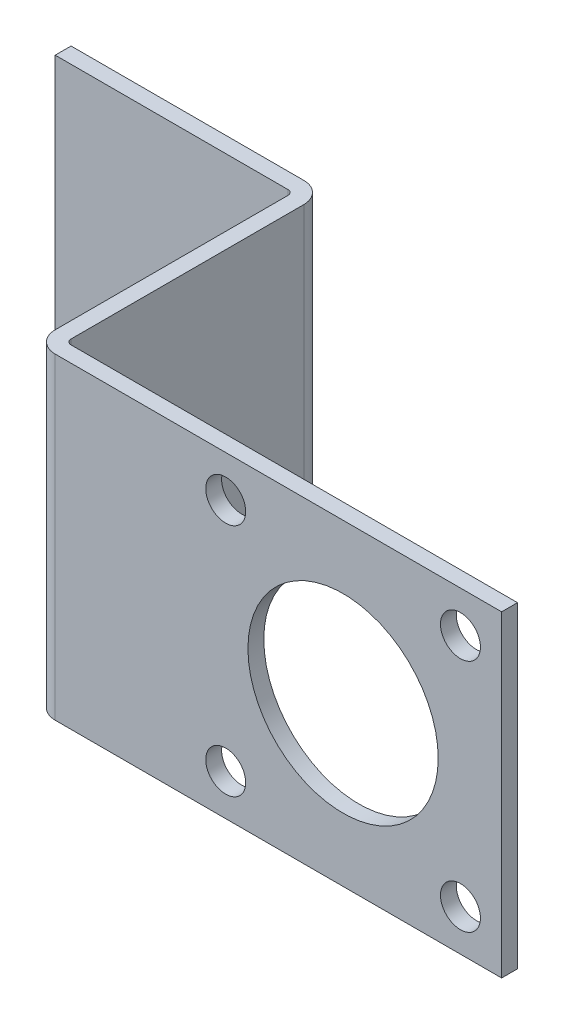
ISO-10303-21;
HEADER;
FILE_DESCRIPTION(('STEP AP214'),'2;1');
FILE_NAME('part.step','',(''),(''),'','','');
FILE_SCHEMA(('AUTOMOTIVE_DESIGN { 1 0 10303 214 1 1 1 1 }'));
ENDSEC;
DATA;
#1=APPLICATION_CONTEXT('core data for automotive mechanical design processes');
#2=APPLICATION_PROTOCOL_DEFINITION('international standard','automotive_design',2000,#1);
#3=PRODUCT_CONTEXT('',#1,'mechanical');
#4=PRODUCT('Part','Part','',(#3));
#5=PRODUCT_RELATED_PRODUCT_CATEGORY('part','',(#4));
#6=PRODUCT_DEFINITION_FORMATION('','',#4);
#7=PRODUCT_DEFINITION_CONTEXT('part definition',#1,'design');
#8=PRODUCT_DEFINITION('design','',#6,#7);
#9=PRODUCT_DEFINITION_SHAPE('','',#8);
#10=(LENGTH_UNIT() NAMED_UNIT(*) SI_UNIT(.MILLI.,.METRE.));
#11=(NAMED_UNIT(*) PLANE_ANGLE_UNIT() SI_UNIT($,.RADIAN.));
#12=(NAMED_UNIT(*) SI_UNIT($,.STERADIAN.) SOLID_ANGLE_UNIT());
#13=UNCERTAINTY_MEASURE_WITH_UNIT(LENGTH_MEASURE(1.E-05),#10,'distance_accuracy_value','');
#14=(GEOMETRIC_REPRESENTATION_CONTEXT(3) GLOBAL_UNCERTAINTY_ASSIGNED_CONTEXT((#13)) GLOBAL_UNIT_ASSIGNED_CONTEXT((#10,
#11,#12)) REPRESENTATION_CONTEXT('',''));
#15=CARTESIAN_POINT('',(0.,0.,0.));
#16=DIRECTION('',(0.,0.,1.));
#17=DIRECTION('',(1.,0.,0.));
#18=AXIS2_PLACEMENT_3D('',#15,#16,#17);
#19=CARTESIAN_POINT('',(-62.864873,31.75,-50.81905));
#20=DIRECTION('',(0.,-1.,0.));
#21=DIRECTION('',(0.,0.,-1.));
#22=AXIS2_PLACEMENT_3D('',#19,#20,#21);
#23=CYLINDRICAL_SURFACE('',#22,4.191);
#24=CARTESIAN_POINT('',(-62.864873,-31.75,-50.81905));
#25=DIRECTION('',(0.,1.,0.));
#26=DIRECTION('',(0.,0.,1.));
#27=AXIS2_PLACEMENT_3D('',#24,#25,#26);
#28=CIRCLE('',#27,4.191);
#29=CARTESIAN_POINT('',(-58.673873,-31.75,-50.81905));
#30=VERTEX_POINT('',#29);
#31=CARTESIAN_POINT('',(-62.864873,-31.75,-55.01005));
#32=VERTEX_POINT('',#31);
#33=EDGE_CURVE('E156',#30,#32,#28,.T.);
#34=ORIENTED_EDGE('',*,*,#33,.T.);
#35=DIRECTION('',(0.,-1.,0.));
#36=VECTOR('',#35,1.);
#37=CARTESIAN_POINT('',(-62.864873,31.75,-55.01005));
#38=LINE('',#37,#36);
#39=CARTESIAN_POINT('',(-62.864873,31.75,-55.01005));
#40=VERTEX_POINT('',#39);
#41=EDGE_CURVE('E11',#40,#32,#38,.T.);
#42=ORIENTED_EDGE('',*,*,#41,.F.);
#43=CARTESIAN_POINT('',(-62.864873,31.75,-50.81905));
#44=DIRECTION('',(0.,1.,0.));
#45=DIRECTION('',(0.,0.,1.));
#46=AXIS2_PLACEMENT_3D('',#43,#44,#45);
#47=CIRCLE('',#46,4.191);
#48=CARTESIAN_POINT('',(-58.673873,31.75,-50.81905));
#49=VERTEX_POINT('',#48);
#50=EDGE_CURVE('E186',#49,#40,#47,.T.);
#51=ORIENTED_EDGE('',*,*,#50,.F.);
#52=DIRECTION('',(0.,-1.,0.));
#53=VECTOR('',#52,1.);
#54=CARTESIAN_POINT('',(-58.673873,31.75,-50.81905));
#55=LINE('',#54,#53);
#56=EDGE_CURVE('E152',#49,#30,#55,.T.);
#57=ORIENTED_EDGE('',*,*,#56,.T.);
#58=EDGE_LOOP('',(#34,#42,#51,#57));
#59=FACE_BOUND('',#58,.T.);
#60=ADVANCED_FACE('F33',(#59),#23,.T.);
#61=CARTESIAN_POINT('',(-62.864873,31.75,-55.01005));
#62=DIRECTION('',(0.,0.,1.));
#63=DIRECTION('',(1.,0.,0.));
#64=AXIS2_PLACEMENT_3D('',#61,#62,#63);
#65=PLANE('',#64);
#66=DIRECTION('',(-1.,0.,0.));
#67=VECTOR('',#66,1.);
#68=CARTESIAN_POINT('',(-62.864873,-31.75,-55.01005));
#69=LINE('',#68,#67);
#70=CARTESIAN_POINT('',(-109.473873,-31.75,-55.01005));
#71=VERTEX_POINT('',#70);
#72=EDGE_CURVE('E159',#32,#71,#69,.T.);
#73=ORIENTED_EDGE('',*,*,#72,.T.);
#74=DIRECTION('',(0.,-1.,0.));
#75=VECTOR('',#74,1.);
#76=CARTESIAN_POINT('',(-109.473873,31.75,-55.01005));
#77=LINE('',#76,#75);
#78=CARTESIAN_POINT('',(-109.473873,31.75,-55.01005));
#79=VERTEX_POINT('',#78);
#80=EDGE_CURVE('E42',#79,#71,#77,.T.);
#81=ORIENTED_EDGE('',*,*,#80,.F.);
#82=DIRECTION('',(-1.,0.,0.));
#83=VECTOR('',#82,1.);
#84=CARTESIAN_POINT('',(-62.864873,31.75,-55.01005));
#85=LINE('',#84,#83);
#86=EDGE_CURVE('E106',#40,#79,#85,.T.);
#87=ORIENTED_EDGE('',*,*,#86,.F.);
#88=ORIENTED_EDGE('',*,*,#41,.T.);
#89=EDGE_LOOP('',(#73,#81,#87,#88));
#90=FACE_BOUND('',#89,.T.);
#91=ADVANCED_FACE('F277',(#90),#65,.F.);
#92=CARTESIAN_POINT('',(-109.473873,31.75,-51.83505));
#93=DIRECTION('',(-1.,0.,0.));
#94=DIRECTION('',(0.,0.,1.));
#95=AXIS2_PLACEMENT_3D('',#92,#93,#94);
#96=PLANE('',#95);
#97=DIRECTION('',(0.,0.,-1.));
#98=VECTOR('',#97,1.);
#99=CARTESIAN_POINT('',(-109.473873,-31.75,-51.83505));
#100=LINE('',#99,#98);
#101=CARTESIAN_POINT('',(-109.473873,-31.75,-51.83505));
#102=VERTEX_POINT('',#101);
#103=EDGE_CURVE('E163',#102,#71,#100,.T.);
#104=ORIENTED_EDGE('',*,*,#103,.F.);
#105=DIRECTION('',(0.,-1.,0.));
#106=VECTOR('',#105,1.);
#107=CARTESIAN_POINT('',(-109.473873,31.75,-51.83505));
#108=LINE('',#107,#106);
#109=CARTESIAN_POINT('',(-109.473873,31.75,-51.83505));
#110=VERTEX_POINT('',#109);
#111=EDGE_CURVE('E200',#110,#102,#108,.T.);
#112=ORIENTED_EDGE('',*,*,#111,.F.);
#113=DIRECTION('',(0.,0.,-1.));
#114=VECTOR('',#113,1.);
#115=CARTESIAN_POINT('',(-109.473873,31.75,-51.83505));
#116=LINE('',#115,#114);
#117=EDGE_CURVE('E233',#110,#79,#116,.T.);
#118=ORIENTED_EDGE('',*,*,#117,.T.);
#119=ORIENTED_EDGE('',*,*,#80,.T.);
#120=EDGE_LOOP('',(#104,#112,#118,#119));
#121=FACE_BOUND('',#120,.T.);
#122=ADVANCED_FACE('F282',(#121),#96,.T.);
#123=CARTESIAN_POINT('',(-62.864873,31.75,-51.83505));
#124=DIRECTION('',(0.,0.,1.));
#125=DIRECTION('',(1.,0.,0.));
#126=AXIS2_PLACEMENT_3D('',#123,#124,#125);
#127=PLANE('',#126);
#128=DIRECTION('',(-1.,0.,0.));
#129=VECTOR('',#128,1.);
#130=CARTESIAN_POINT('',(-62.864873,-31.75,-51.83505));
#131=LINE('',#130,#129);
#132=CARTESIAN_POINT('',(-62.864873,-31.75,-51.83505));
#133=VERTEX_POINT('',#132);
#134=EDGE_CURVE('E166',#133,#102,#131,.T.);
#135=ORIENTED_EDGE('',*,*,#134,.F.);
#136=DIRECTION('',(0.,-1.,0.));
#137=VECTOR('',#136,1.);
#138=CARTESIAN_POINT('',(-62.864873,31.75,-51.83505));
#139=LINE('',#138,#137);
#140=CARTESIAN_POINT('',(-62.864873,31.75,-51.83505));
#141=VERTEX_POINT('',#140);
#142=EDGE_CURVE('E198',#141,#133,#139,.T.);
#143=ORIENTED_EDGE('',*,*,#142,.F.);
#144=DIRECTION('',(-1.,0.,0.));
#145=VECTOR('',#144,1.);
#146=CARTESIAN_POINT('',(-62.864873,31.75,-51.83505));
#147=LINE('',#146,#145);
#148=EDGE_CURVE('E236',#141,#110,#147,.T.);
#149=ORIENTED_EDGE('',*,*,#148,.T.);
#150=ORIENTED_EDGE('',*,*,#111,.T.);
#151=EDGE_LOOP('',(#135,#143,#149,#150));
#152=FACE_BOUND('',#151,.T.);
#153=ADVANCED_FACE('F291',(#152),#127,.T.);
#154=CARTESIAN_POINT('',(-62.864873,31.75,-50.81905));
#155=DIRECTION('',(0.,-1.,0.));
#156=DIRECTION('',(0.,0.,-1.));
#157=AXIS2_PLACEMENT_3D('',#154,#155,#156);
#158=CYLINDRICAL_SURFACE('',#157,1.01600000000001);
#159=CARTESIAN_POINT('',(-62.864873,-31.75,-50.81905));
#160=DIRECTION('',(0.,1.,0.));
#161=DIRECTION('',(0.,0.,1.));
#162=AXIS2_PLACEMENT_3D('',#159,#160,#161);
#163=CIRCLE('',#162,1.01600000000001);
#164=CARTESIAN_POINT('',(-61.848873,-31.75,-50.81905));
#165=VERTEX_POINT('',#164);
#166=EDGE_CURVE('E169',#165,#133,#163,.T.);
#167=ORIENTED_EDGE('',*,*,#166,.F.);
#168=DIRECTION('',(0.,-1.,0.));
#169=VECTOR('',#168,1.);
#170=CARTESIAN_POINT('',(-61.848873,31.75,-50.81905));
#171=LINE('',#170,#169);
#172=CARTESIAN_POINT('',(-61.848873,31.75,-50.81905));
#173=VERTEX_POINT('',#172);
#174=EDGE_CURVE('E196',#173,#165,#171,.T.);
#175=ORIENTED_EDGE('',*,*,#174,.F.);
#176=CARTESIAN_POINT('',(-62.864873,31.75,-50.81905));
#177=DIRECTION('',(0.,1.,0.));
#178=DIRECTION('',(0.,0.,1.));
#179=AXIS2_PLACEMENT_3D('',#176,#177,#178);
#180=CIRCLE('',#179,1.01600000000001);
#181=EDGE_CURVE('E239',#173,#141,#180,.T.);
#182=ORIENTED_EDGE('',*,*,#181,.T.);
#183=ORIENTED_EDGE('',*,*,#142,.T.);
#184=EDGE_LOOP('',(#167,#175,#182,#183));
#185=FACE_BOUND('',#184,.T.);
#186=ADVANCED_FACE('F294',(#185),#158,.F.);
#187=CARTESIAN_POINT('',(-61.848873,31.75,-4.19099999999999));
#188=DIRECTION('',(-1.,0.,0.));
#189=DIRECTION('',(0.,0.,1.));
#190=AXIS2_PLACEMENT_3D('',#187,#188,#189);
#191=PLANE('',#190);
#192=DIRECTION('',(0.,0.,-1.));
#193=VECTOR('',#192,1.);
#194=CARTESIAN_POINT('',(-61.848873,-31.75,-4.19099999999999));
#195=LINE('',#194,#193);
#196=CARTESIAN_POINT('',(-61.848873,-31.75,-4.19099999999999));
#197=VERTEX_POINT('',#196);
#198=EDGE_CURVE('E172',#197,#165,#195,.T.);
#199=ORIENTED_EDGE('',*,*,#198,.F.);
#200=DIRECTION('',(0.,-1.,0.));
#201=VECTOR('',#200,1.);
#202=CARTESIAN_POINT('',(-61.848873,31.75,-4.19099999999999));
#203=LINE('',#202,#201);
#204=CARTESIAN_POINT('',(-61.848873,31.75,-4.19099999999999));
#205=VERTEX_POINT('',#204);
#206=EDGE_CURVE('E194',#205,#197,#203,.T.);
#207=ORIENTED_EDGE('',*,*,#206,.F.);
#208=DIRECTION('',(0.,0.,-1.));
#209=VECTOR('',#208,1.);
#210=CARTESIAN_POINT('',(-61.848873,31.75,-4.19099999999999));
#211=LINE('',#210,#209);
#212=EDGE_CURVE('E242',#205,#173,#211,.T.);
#213=ORIENTED_EDGE('',*,*,#212,.T.);
#214=ORIENTED_EDGE('',*,*,#174,.T.);
#215=EDGE_LOOP('',(#199,#207,#213,#214));
#216=FACE_BOUND('',#215,.T.);
#217=ADVANCED_FACE('F296',(#216),#191,.T.);
#218=CARTESIAN_POINT('',(-57.657873,31.75,-4.19099999999999));
#219=DIRECTION('',(0.,-1.,0.));
#220=DIRECTION('',(0.,0.,-1.));
#221=AXIS2_PLACEMENT_3D('',#218,#219,#220);
#222=CYLINDRICAL_SURFACE('',#221,4.191);
#223=CARTESIAN_POINT('',(-57.657873,-31.75,-4.19099999999999));
#224=DIRECTION('',(0.,-1.,0.));
#225=DIRECTION('',(0.,0.,-1.));
#226=AXIS2_PLACEMENT_3D('',#223,#224,#225);
#227=CIRCLE('',#226,4.191);
#228=CARTESIAN_POINT('',(-57.657873,-31.75,0.));
#229=VERTEX_POINT('',#228);
#230=EDGE_CURVE('E175',#229,#197,#227,.T.);
#231=ORIENTED_EDGE('',*,*,#230,.F.);
#232=DIRECTION('',(0.,-1.,0.));
#233=VECTOR('',#232,1.);
#234=CARTESIAN_POINT('',(-57.657873,31.75,0.));
#235=LINE('',#234,#233);
#236=CARTESIAN_POINT('',(-57.657873,31.75,0.));
#237=VERTEX_POINT('',#236);
#238=EDGE_CURVE('E192',#237,#229,#235,.T.);
#239=ORIENTED_EDGE('',*,*,#238,.F.);
#240=CARTESIAN_POINT('',(-57.657873,31.75,-4.19099999999999));
#241=DIRECTION('',(0.,-1.,0.));
#242=DIRECTION('',(0.,0.,-1.));
#243=AXIS2_PLACEMENT_3D('',#240,#241,#242);
#244=CIRCLE('',#243,4.191);
#245=EDGE_CURVE('E245',#237,#205,#244,.T.);
#246=ORIENTED_EDGE('',*,*,#245,.T.);
#247=ORIENTED_EDGE('',*,*,#206,.T.);
#248=EDGE_LOOP('',(#231,#239,#246,#247));
#249=FACE_BOUND('',#248,.T.);
#250=ADVANCED_FACE('F258',(#249),#222,.T.);
#251=CARTESIAN_POINT('',(31.75,31.75,0.));
#252=DIRECTION('',(0.,0.,1.));
#253=DIRECTION('',(1.,0.,0.));
#254=AXIS2_PLACEMENT_3D('',#251,#252,#253);
#255=PLANE('',#254);
#256=CARTESIAN_POINT('',(23.5,23.5,0.));
#257=DIRECTION('',(0.,0.,1.));
#258=DIRECTION('',(1.,0.,0.));
#259=AXIS2_PLACEMENT_3D('',#256,#257,#258);
#260=CIRCLE('',#259,4.);
#261=CARTESIAN_POINT('',(27.5,23.5,0.));
#262=VERTEX_POINT('',#261);
#263=EDGE_CURVE('E206',#262,#262,#260,.T.);
#264=ORIENTED_EDGE('',*,*,#263,.F.);
#265=EDGE_LOOP('',(#264));
#266=FACE_BOUND('',#265,.T.);
#267=CARTESIAN_POINT('',(23.5,-23.5,0.));
#268=DIRECTION('',(0.,0.,1.));
#269=DIRECTION('',(1.,0.,0.));
#270=AXIS2_PLACEMENT_3D('',#267,#268,#269);
#271=CIRCLE('',#270,4.);
#272=CARTESIAN_POINT('',(27.5,-23.5,0.));
#273=VERTEX_POINT('',#272);
#274=EDGE_CURVE('E216',#273,#273,#271,.T.);
#275=ORIENTED_EDGE('',*,*,#274,.F.);
#276=EDGE_LOOP('',(#275));
#277=FACE_BOUND('',#276,.T.);
#278=CARTESIAN_POINT('',(-23.5,-23.5,0.));
#279=DIRECTION('',(0.,0.,1.));
#280=DIRECTION('',(1.,0.,0.));
#281=AXIS2_PLACEMENT_3D('',#278,#279,#280);
#282=CIRCLE('',#281,4.);
#283=CARTESIAN_POINT('',(-19.5,-23.5,0.));
#284=VERTEX_POINT('',#283);
#285=EDGE_CURVE('E213',#284,#284,#282,.T.);
#286=ORIENTED_EDGE('',*,*,#285,.F.);
#287=EDGE_LOOP('',(#286));
#288=FACE_BOUND('',#287,.T.);
#289=CARTESIAN_POINT('',(-23.5,23.5,0.));
#290=DIRECTION('',(0.,0.,1.));
#291=DIRECTION('',(1.,0.,0.));
#292=AXIS2_PLACEMENT_3D('',#289,#290,#291);
#293=CIRCLE('',#292,4.);
#294=CARTESIAN_POINT('',(-19.5,23.5,0.));
#295=VERTEX_POINT('',#294);
#296=EDGE_CURVE('E210',#295,#295,#293,.T.);
#297=ORIENTED_EDGE('',*,*,#296,.F.);
#298=EDGE_LOOP('',(#297));
#299=FACE_BOUND('',#298,.T.);
#300=CARTESIAN_POINT('',(0.,0.,0.));
#301=DIRECTION('',(0.,0.,1.));
#302=DIRECTION('',(1.,0.,0.));
#303=AXIS2_PLACEMENT_3D('',#300,#301,#302);
#304=CIRCLE('',#303,19.05);
#305=CARTESIAN_POINT('',(19.05,0.,0.));
#306=VERTEX_POINT('',#305);
#307=EDGE_CURVE('E160',#306,#306,#304,.T.);
#308=ORIENTED_EDGE('',*,*,#307,.F.);
#309=EDGE_LOOP('',(#308));
#310=FACE_BOUND('',#309,.T.);
#311=DIRECTION('',(-1.,0.,0.));
#312=VECTOR('',#311,1.);
#313=CARTESIAN_POINT('',(31.75,-31.75,0.));
#314=LINE('',#313,#312);
#315=CARTESIAN_POINT('',(31.75,-31.75,0.));
#316=VERTEX_POINT('',#315);
#317=EDGE_CURVE('E178',#316,#229,#314,.T.);
#318=ORIENTED_EDGE('',*,*,#317,.F.);
#319=DIRECTION('',(0.,-1.,0.));
#320=VECTOR('',#319,1.);
#321=CARTESIAN_POINT('',(31.75,31.75,0.));
#322=LINE('',#321,#320);
#323=CARTESIAN_POINT('',(31.75,31.75,0.));
#324=VERTEX_POINT('',#323);
#325=EDGE_CURVE('E190',#324,#316,#322,.T.);
#326=ORIENTED_EDGE('',*,*,#325,.F.);
#327=DIRECTION('',(-1.,0.,0.));
#328=VECTOR('',#327,1.);
#329=CARTESIAN_POINT('',(31.75,31.75,0.));
#330=LINE('',#329,#328);
#331=EDGE_CURVE('E248',#324,#237,#330,.T.);
#332=ORIENTED_EDGE('',*,*,#331,.T.);
#333=ORIENTED_EDGE('',*,*,#238,.T.);
#334=EDGE_LOOP('',(#318,#326,#332,#333));
#335=FACE_BOUND('',#334,.T.);
#336=ADVANCED_FACE('F252',(#266,#277,#288,#299,#310,#335),#255,.T.);
#337=CARTESIAN_POINT('',(31.75,31.75,0.));
#338=DIRECTION('',(-1.,0.,0.));
#339=DIRECTION('',(0.,0.,1.));
#340=AXIS2_PLACEMENT_3D('',#337,#338,#339);
#341=PLANE('',#340);
#342=DIRECTION('',(0.,0.,-1.));
#343=VECTOR('',#342,1.);
#344=CARTESIAN_POINT('',(31.75,-31.75,0.));
#345=LINE('',#344,#343);
#346=CARTESIAN_POINT('',(31.75,-31.75,-3.175));
#347=VERTEX_POINT('',#346);
#348=EDGE_CURVE('E181',#316,#347,#345,.T.);
#349=ORIENTED_EDGE('',*,*,#348,.T.);
#350=DIRECTION('',(0.,-1.,0.));
#351=VECTOR('',#350,1.);
#352=CARTESIAN_POINT('',(31.75,31.75,-3.175));
#353=LINE('',#352,#351);
#354=CARTESIAN_POINT('',(31.75,31.75,-3.175));
#355=VERTEX_POINT('',#354);
#356=EDGE_CURVE('E147',#355,#347,#353,.T.);
#357=ORIENTED_EDGE('',*,*,#356,.F.);
#358=DIRECTION('',(0.,0.,-1.));
#359=VECTOR('',#358,1.);
#360=CARTESIAN_POINT('',(31.75,31.75,0.));
#361=LINE('',#360,#359);
#362=EDGE_CURVE('E138',#324,#355,#361,.T.);
#363=ORIENTED_EDGE('',*,*,#362,.F.);
#364=ORIENTED_EDGE('',*,*,#325,.T.);
#365=EDGE_LOOP('',(#349,#357,#363,#364));
#366=FACE_BOUND('',#365,.T.);
#367=ADVANCED_FACE('F265',(#366),#341,.F.);
#368=CARTESIAN_POINT('',(31.75,31.75,-3.175));
#369=DIRECTION('',(0.,0.,1.));
#370=DIRECTION('',(1.,0.,0.));
#371=AXIS2_PLACEMENT_3D('',#368,#369,#370);
#372=PLANE('',#371);
#373=CARTESIAN_POINT('',(23.5,23.5,-3.175));
#374=DIRECTION('',(0.,0.,1.));
#375=DIRECTION('',(1.,0.,0.));
#376=AXIS2_PLACEMENT_3D('',#373,#374,#375);
#377=CIRCLE('',#376,4.);
#378=CARTESIAN_POINT('',(27.5,23.5,-3.175));
#379=VERTEX_POINT('',#378);
#380=EDGE_CURVE('E36',#379,#379,#377,.T.);
#381=ORIENTED_EDGE('',*,*,#380,.T.);
#382=EDGE_LOOP('',(#381));
#383=FACE_BOUND('',#382,.T.);
#384=CARTESIAN_POINT('',(23.5,-23.5,-3.175));
#385=DIRECTION('',(0.,0.,1.));
#386=DIRECTION('',(1.,0.,0.));
#387=AXIS2_PLACEMENT_3D('',#384,#385,#386);
#388=CIRCLE('',#387,4.);
#389=CARTESIAN_POINT('',(27.5,-23.5,-3.175));
#390=VERTEX_POINT('',#389);
#391=EDGE_CURVE('E214',#390,#390,#388,.T.);
#392=ORIENTED_EDGE('',*,*,#391,.T.);
#393=EDGE_LOOP('',(#392));
#394=FACE_BOUND('',#393,.T.);
#395=CARTESIAN_POINT('',(-23.5,-23.5,-3.17499999999999));
#396=DIRECTION('',(0.,0.,1.));
#397=DIRECTION('',(1.,0.,0.));
#398=AXIS2_PLACEMENT_3D('',#395,#396,#397);
#399=CIRCLE('',#398,4.);
#400=CARTESIAN_POINT('',(-19.5,-23.5,-3.17499999999999));
#401=VERTEX_POINT('',#400);
#402=EDGE_CURVE('E211',#401,#401,#399,.T.);
#403=ORIENTED_EDGE('',*,*,#402,.T.);
#404=EDGE_LOOP('',(#403));
#405=FACE_BOUND('',#404,.T.);
#406=CARTESIAN_POINT('',(-23.5,23.5,-3.17499999999999));
#407=DIRECTION('',(0.,0.,1.));
#408=DIRECTION('',(1.,0.,0.));
#409=AXIS2_PLACEMENT_3D('',#406,#407,#408);
#410=CIRCLE('',#409,4.);
#411=CARTESIAN_POINT('',(-19.5,23.5,-3.17499999999999));
#412=VERTEX_POINT('',#411);
#413=EDGE_CURVE('E207',#412,#412,#410,.T.);
#414=ORIENTED_EDGE('',*,*,#413,.T.);
#415=EDGE_LOOP('',(#414));
#416=FACE_BOUND('',#415,.T.);
#417=CARTESIAN_POINT('',(0.,0.,-3.17499999999999));
#418=DIRECTION('',(0.,0.,1.));
#419=DIRECTION('',(1.,0.,0.));
#420=AXIS2_PLACEMENT_3D('',#417,#418,#419);
#421=CIRCLE('',#420,19.05);
#422=CARTESIAN_POINT('',(19.05,0.,-3.17499999999999));
#423=VERTEX_POINT('',#422);
#424=EDGE_CURVE('E203',#423,#423,#421,.T.);
#425=ORIENTED_EDGE('',*,*,#424,.T.);
#426=EDGE_LOOP('',(#425));
#427=FACE_BOUND('',#426,.T.);
#428=DIRECTION('',(-1.,0.,0.));
#429=VECTOR('',#428,1.);
#430=CARTESIAN_POINT('',(31.75,-31.75,-3.175));
#431=LINE('',#430,#429);
#432=CARTESIAN_POINT('',(-57.657873,-31.75,-3.17499999999999));
#433=VERTEX_POINT('',#432);
#434=EDGE_CURVE('E146',#347,#433,#431,.T.);
#435=ORIENTED_EDGE('',*,*,#434,.T.);
#436=DIRECTION('',(0.,-1.,0.));
#437=VECTOR('',#436,1.);
#438=CARTESIAN_POINT('',(-57.657873,31.75,-3.17499999999999));
#439=LINE('',#438,#437);
#440=CARTESIAN_POINT('',(-57.657873,31.75,-3.17499999999999));
#441=VERTEX_POINT('',#440);
#442=EDGE_CURVE('E143',#441,#433,#439,.T.);
#443=ORIENTED_EDGE('',*,*,#442,.F.);
#444=DIRECTION('',(-1.,0.,0.));
#445=VECTOR('',#444,1.);
#446=CARTESIAN_POINT('',(31.75,31.75,-3.175));
#447=LINE('',#446,#445);
#448=EDGE_CURVE('E131',#355,#441,#447,.T.);
#449=ORIENTED_EDGE('',*,*,#448,.F.);
#450=ORIENTED_EDGE('',*,*,#356,.T.);
#451=EDGE_LOOP('',(#435,#443,#449,#450));
#452=FACE_BOUND('',#451,.T.);
#453=ADVANCED_FACE('F144',(#383,#394,#405,#416,#427,#452),#372,.F.);
#454=CARTESIAN_POINT('',(-57.657873,31.75,-4.19099999999999));
#455=DIRECTION('',(0.,-1.,0.));
#456=DIRECTION('',(0.,0.,-1.));
#457=AXIS2_PLACEMENT_3D('',#454,#455,#456);
#458=CYLINDRICAL_SURFACE('',#457,1.016);
#459=CARTESIAN_POINT('',(-57.657873,-31.75,-4.19099999999999));
#460=DIRECTION('',(0.,-1.,0.));
#461=DIRECTION('',(0.,0.,-1.));
#462=AXIS2_PLACEMENT_3D('',#459,#460,#461);
#463=CIRCLE('',#462,1.016);
#464=CARTESIAN_POINT('',(-58.673873,-31.75,-4.19099999999999));
#465=VERTEX_POINT('',#464);
#466=EDGE_CURVE('E92',#433,#465,#463,.T.);
#467=ORIENTED_EDGE('',*,*,#466,.T.);
#468=DIRECTION('',(0.,-1.,0.));
#469=VECTOR('',#468,1.);
#470=CARTESIAN_POINT('',(-58.673873,31.75,-4.19099999999999));
#471=LINE('',#470,#469);
#472=CARTESIAN_POINT('',(-58.673873,31.75,-4.19099999999999));
#473=VERTEX_POINT('',#472);
#474=EDGE_CURVE('E148',#473,#465,#471,.T.);
#475=ORIENTED_EDGE('',*,*,#474,.F.);
#476=CARTESIAN_POINT('',(-57.657873,31.75,-4.19099999999999));
#477=DIRECTION('',(0.,-1.,0.));
#478=DIRECTION('',(0.,0.,-1.));
#479=AXIS2_PLACEMENT_3D('',#476,#477,#478);
#480=CIRCLE('',#479,1.016);
#481=EDGE_CURVE('E135',#441,#473,#480,.T.);
#482=ORIENTED_EDGE('',*,*,#481,.F.);
#483=ORIENTED_EDGE('',*,*,#442,.T.);
#484=EDGE_LOOP('',(#467,#475,#482,#483));
#485=FACE_BOUND('',#484,.T.);
#486=ADVANCED_FACE('F150',(#485),#458,.F.);
#487=CARTESIAN_POINT('',(-58.673873,31.75,-4.19099999999999));
#488=DIRECTION('',(-1.,0.,0.));
#489=DIRECTION('',(0.,0.,1.));
#490=AXIS2_PLACEMENT_3D('',#487,#488,#489);
#491=PLANE('',#490);
#492=DIRECTION('',(0.,0.,-1.));
#493=VECTOR('',#492,1.);
#494=CARTESIAN_POINT('',(-58.673873,-31.75,-4.19099999999999));
#495=LINE('',#494,#493);
#496=EDGE_CURVE('E98',#465,#30,#495,.T.);
#497=ORIENTED_EDGE('',*,*,#496,.T.);
#498=ORIENTED_EDGE('',*,*,#56,.F.);
#499=DIRECTION('',(0.,0.,-1.));
#500=VECTOR('',#499,1.);
#501=CARTESIAN_POINT('',(-58.673873,31.75,-4.19099999999999));
#502=LINE('',#501,#500);
#503=EDGE_CURVE('E51',#473,#49,#502,.T.);
#504=ORIENTED_EDGE('',*,*,#503,.F.);
#505=ORIENTED_EDGE('',*,*,#474,.T.);
#506=EDGE_LOOP('',(#497,#498,#504,#505));
#507=FACE_BOUND('',#506,.T.);
#508=ADVANCED_FACE('F346',(#507),#491,.F.);
#509=CARTESIAN_POINT('',(-62.864873,31.75,-50.81905));
#510=DIRECTION('',(0.,1.,0.));
#511=DIRECTION('',(0.,0.,1.));
#512=AXIS2_PLACEMENT_3D('',#509,#510,#511);
#513=PLANE('',#512);
#514=ORIENTED_EDGE('',*,*,#50,.T.);
#515=ORIENTED_EDGE('',*,*,#86,.T.);
#516=ORIENTED_EDGE('',*,*,#117,.F.);
#517=ORIENTED_EDGE('',*,*,#148,.F.);
#518=ORIENTED_EDGE('',*,*,#181,.F.);
#519=ORIENTED_EDGE('',*,*,#212,.F.);
#520=ORIENTED_EDGE('',*,*,#245,.F.);
#521=ORIENTED_EDGE('',*,*,#331,.F.);
#522=ORIENTED_EDGE('',*,*,#362,.T.);
#523=ORIENTED_EDGE('',*,*,#448,.T.);
#524=ORIENTED_EDGE('',*,*,#481,.T.);
#525=ORIENTED_EDGE('',*,*,#503,.T.);
#526=EDGE_LOOP('',(#514,#515,#516,#517,#518,#519,#520,#521,#522,#523,#524,#525));
#527=FACE_BOUND('',#526,.T.);
#528=ADVANCED_FACE('F133',(#527),#513,.T.);
#529=CARTESIAN_POINT('',(-62.864873,-31.75,-50.81905));
#530=DIRECTION('',(0.,1.,0.));
#531=DIRECTION('',(0.,0.,1.));
#532=AXIS2_PLACEMENT_3D('',#529,#530,#531);
#533=PLANE('',#532);
#534=ORIENTED_EDGE('',*,*,#33,.F.);
#535=ORIENTED_EDGE('',*,*,#496,.F.);
#536=ORIENTED_EDGE('',*,*,#466,.F.);
#537=ORIENTED_EDGE('',*,*,#434,.F.);
#538=ORIENTED_EDGE('',*,*,#348,.F.);
#539=ORIENTED_EDGE('',*,*,#317,.T.);
#540=ORIENTED_EDGE('',*,*,#230,.T.);
#541=ORIENTED_EDGE('',*,*,#198,.T.);
#542=ORIENTED_EDGE('',*,*,#166,.T.);
#543=ORIENTED_EDGE('',*,*,#134,.T.);
#544=ORIENTED_EDGE('',*,*,#103,.T.);
#545=ORIENTED_EDGE('',*,*,#72,.F.);
#546=EDGE_LOOP('',(#534,#535,#536,#537,#538,#539,#540,#541,#542,#543,#544,#545));
#547=FACE_BOUND('',#546,.T.);
#548=ADVANCED_FACE('F263',(#547),#533,.F.);
#549=CARTESIAN_POINT('',(0.,0.,-55.01005));
#550=DIRECTION('',(0.,0.,1.));
#551=DIRECTION('',(1.,0.,0.));
#552=AXIS2_PLACEMENT_3D('',#549,#550,#551);
#553=CYLINDRICAL_SURFACE('',#552,19.05);
#554=ORIENTED_EDGE('',*,*,#307,.T.);
#555=EDGE_LOOP('',(#554));
#556=FACE_BOUND('',#555,.T.);
#557=ORIENTED_EDGE('',*,*,#424,.F.);
#558=EDGE_LOOP('',(#557));
#559=FACE_BOUND('',#558,.T.);
#560=ADVANCED_FACE('F371',(#556,#559),#553,.F.);
#561=CARTESIAN_POINT('',(-23.5,23.5,-55.01005));
#562=DIRECTION('',(0.,0.,1.));
#563=DIRECTION('',(1.,0.,0.));
#564=AXIS2_PLACEMENT_3D('',#561,#562,#563);
#565=CYLINDRICAL_SURFACE('',#564,4.);
#566=ORIENTED_EDGE('',*,*,#296,.T.);
#567=EDGE_LOOP('',(#566));
#568=FACE_BOUND('',#567,.T.);
#569=ORIENTED_EDGE('',*,*,#413,.F.);
#570=EDGE_LOOP('',(#569));
#571=FACE_BOUND('',#570,.T.);
#572=ADVANCED_FACE('F390',(#568,#571),#565,.F.);
#573=CARTESIAN_POINT('',(-23.5,-23.5,-55.01005));
#574=DIRECTION('',(0.,0.,1.));
#575=DIRECTION('',(1.,0.,0.));
#576=AXIS2_PLACEMENT_3D('',#573,#574,#575);
#577=CYLINDRICAL_SURFACE('',#576,4.);
#578=ORIENTED_EDGE('',*,*,#285,.T.);
#579=EDGE_LOOP('',(#578));
#580=FACE_BOUND('',#579,.T.);
#581=ORIENTED_EDGE('',*,*,#402,.F.);
#582=EDGE_LOOP('',(#581));
#583=FACE_BOUND('',#582,.T.);
#584=ADVANCED_FACE('F400',(#580,#583),#577,.F.);
#585=CARTESIAN_POINT('',(23.5,-23.5,-55.01005));
#586=DIRECTION('',(0.,0.,1.));
#587=DIRECTION('',(1.,0.,0.));
#588=AXIS2_PLACEMENT_3D('',#585,#586,#587);
#589=CYLINDRICAL_SURFACE('',#588,4.);
#590=ORIENTED_EDGE('',*,*,#274,.T.);
#591=EDGE_LOOP('',(#590));
#592=FACE_BOUND('',#591,.T.);
#593=ORIENTED_EDGE('',*,*,#391,.F.);
#594=EDGE_LOOP('',(#593));
#595=FACE_BOUND('',#594,.T.);
#596=ADVANCED_FACE('F410',(#592,#595),#589,.F.);
#597=CARTESIAN_POINT('',(23.5,23.5,-55.01005));
#598=DIRECTION('',(0.,0.,1.));
#599=DIRECTION('',(1.,0.,0.));
#600=AXIS2_PLACEMENT_3D('',#597,#598,#599);
#601=CYLINDRICAL_SURFACE('',#600,4.);
#602=ORIENTED_EDGE('',*,*,#263,.T.);
#603=EDGE_LOOP('',(#602));
#604=FACE_BOUND('',#603,.T.);
#605=ORIENTED_EDGE('',*,*,#380,.F.);
#606=EDGE_LOOP('',(#605));
#607=FACE_BOUND('',#606,.T.);
#608=ADVANCED_FACE('F419',(#604,#607),#601,.F.);
#609=CLOSED_SHELL('',(#60,#91,#122,#153,#186,#217,#250,#336,#367,#453,#486,#508,#528,#548,#560,
#572,#584,#596,#608));
#610=MANIFOLD_SOLID_BREP('B2',#609);
#611=ADVANCED_BREP_SHAPE_REPRESENTATION('',(#18,#610),#14);
#612=SHAPE_DEFINITION_REPRESENTATION(#9,#611);
ENDSEC;
END-ISO-10303-21;
